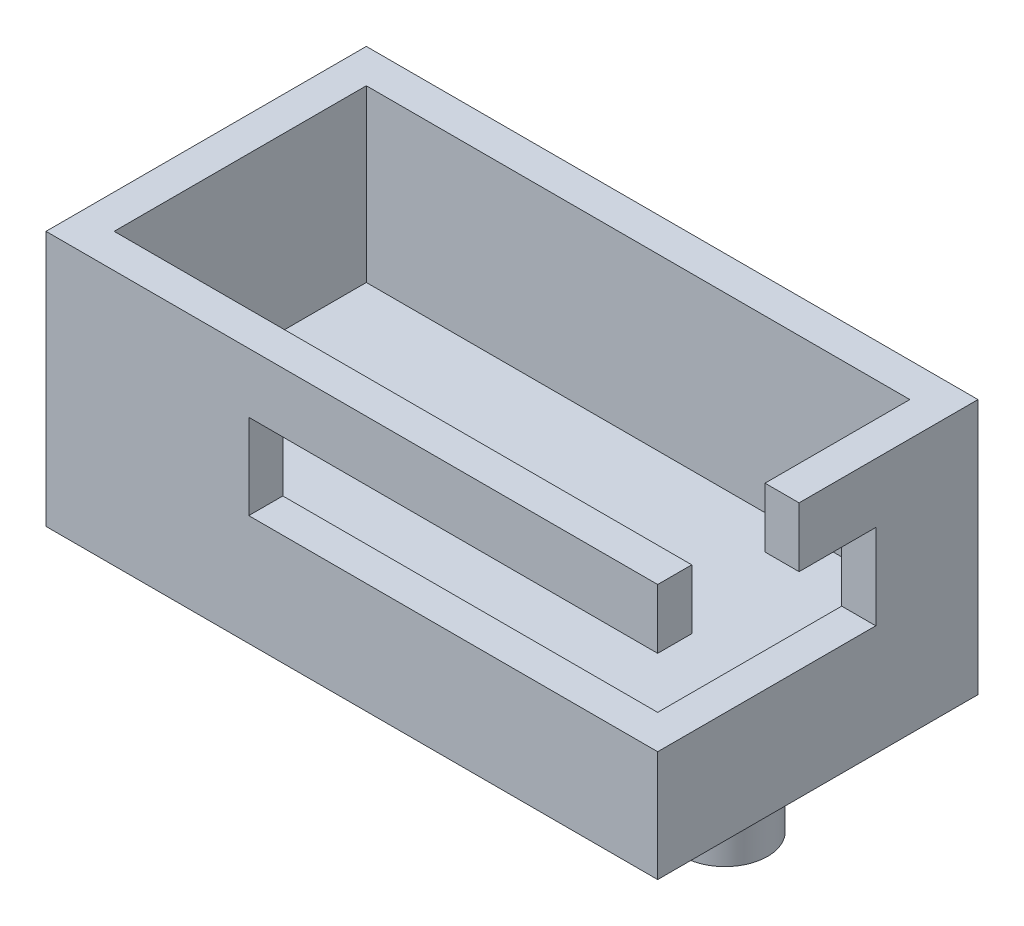
ISO-10303-21;
HEADER;
FILE_DESCRIPTION(('STEP AP214'),'2;1');
FILE_NAME('part.step','',(''),(''),'','','');
FILE_SCHEMA(('AUTOMOTIVE_DESIGN { 1 0 10303 214 1 1 1 1 }'));
ENDSEC;
DATA;
#1=APPLICATION_CONTEXT('core data for automotive mechanical design processes');
#2=APPLICATION_PROTOCOL_DEFINITION('international standard','automotive_design',2000,#1);
#3=PRODUCT_CONTEXT('',#1,'mechanical');
#4=PRODUCT('Part','Part','',(#3));
#5=PRODUCT_RELATED_PRODUCT_CATEGORY('part','',(#4));
#6=PRODUCT_DEFINITION_FORMATION('','',#4);
#7=PRODUCT_DEFINITION_CONTEXT('part definition',#1,'design');
#8=PRODUCT_DEFINITION('design','',#6,#7);
#9=PRODUCT_DEFINITION_SHAPE('','',#8);
#10=(LENGTH_UNIT() NAMED_UNIT(*) SI_UNIT(.MILLI.,.METRE.));
#11=(NAMED_UNIT(*) PLANE_ANGLE_UNIT() SI_UNIT($,.RADIAN.));
#12=(NAMED_UNIT(*) SI_UNIT($,.STERADIAN.) SOLID_ANGLE_UNIT());
#13=UNCERTAINTY_MEASURE_WITH_UNIT(LENGTH_MEASURE(1.E-05),#10,'distance_accuracy_value','');
#14=(GEOMETRIC_REPRESENTATION_CONTEXT(3) GLOBAL_UNCERTAINTY_ASSIGNED_CONTEXT((#13)) GLOBAL_UNIT_ASSIGNED_CONTEXT((#10,
#11,#12)) REPRESENTATION_CONTEXT('',''));
#15=CARTESIAN_POINT('',(0.,0.,0.));
#16=DIRECTION('',(0.,0.,1.));
#17=DIRECTION('',(1.,0.,0.));
#18=AXIS2_PLACEMENT_3D('',#15,#16,#17);
#19=CARTESIAN_POINT('',(33.9,10.,2.));
#20=DIRECTION('',(-1.,0.,0.));
#21=DIRECTION('',(0.,0.,1.));
#22=AXIS2_PLACEMENT_3D('',#19,#20,#21);
#23=PLANE('',#22);
#24=DIRECTION('',(0.,0.,-1.));
#25=VECTOR('',#24,1.);
#26=CARTESIAN_POINT('',(33.9,10.,2.));
#27=LINE('',#26,#25);
#28=CARTESIAN_POINT('',(33.9,10.,-6.3));
#29=VERTEX_POINT('',#28);
#30=CARTESIAN_POINT('',(33.9,10.,-16.8));
#31=VERTEX_POINT('',#30);
#32=EDGE_CURVE('E195',#29,#31,#27,.T.);
#33=ORIENTED_EDGE('',*,*,#32,.F.);
#34=DIRECTION('',(0.,1.,0.));
#35=VECTOR('',#34,1.);
#36=CARTESIAN_POINT('',(33.9,6.5,-6.3));
#37=LINE('',#36,#35);
#38=CARTESIAN_POINT('',(33.9,6.5,-6.3));
#39=VERTEX_POINT('',#38);
#40=EDGE_CURVE('E185',#39,#29,#37,.T.);
#41=ORIENTED_EDGE('',*,*,#40,.F.);
#42=DIRECTION('',(0.,0.,1.));
#43=VECTOR('',#42,1.);
#44=CARTESIAN_POINT('',(33.9,6.5,-41.3153013442625));
#45=LINE('',#44,#43);
#46=CARTESIAN_POINT('',(33.9,6.5,-10.8));
#47=VERTEX_POINT('',#46);
#48=EDGE_CURVE('E300',#47,#39,#45,.T.);
#49=ORIENTED_EDGE('',*,*,#48,.F.);
#50=DIRECTION('',(0.,-1.,0.));
#51=VECTOR('',#50,1.);
#52=CARTESIAN_POINT('',(33.9,6.5,-10.8));
#53=LINE('',#52,#51);
#54=CARTESIAN_POINT('',(33.9,1.5,-10.8));
#55=VERTEX_POINT('',#54);
#56=EDGE_CURVE('E278',#47,#55,#53,.T.);
#57=ORIENTED_EDGE('',*,*,#56,.T.);
#58=DIRECTION('',(0.,0.,1.));
#59=VECTOR('',#58,1.);
#60=CARTESIAN_POINT('',(33.9,1.5,-41.3153013442625));
#61=LINE('',#60,#59);
#62=CARTESIAN_POINT('',(33.9,1.5,2.));
#63=VERTEX_POINT('',#62);
#64=EDGE_CURVE('E304',#55,#63,#61,.T.);
#65=ORIENTED_EDGE('',*,*,#64,.T.);
#66=DIRECTION('',(0.,-1.,0.));
#67=VECTOR('',#66,1.);
#68=CARTESIAN_POINT('',(33.9,10.,2.));
#69=LINE('',#68,#67);
#70=CARTESIAN_POINT('',(33.9,-5.,2.));
#71=VERTEX_POINT('',#70);
#72=EDGE_CURVE('E215',#63,#71,#69,.T.);
#73=ORIENTED_EDGE('',*,*,#72,.T.);
#74=DIRECTION('',(0.,0.,-1.));
#75=VECTOR('',#74,1.);
#76=CARTESIAN_POINT('',(33.9,-5.,0.));
#77=LINE('',#76,#75);
#78=CARTESIAN_POINT('',(33.9,-5.,-16.8));
#79=VERTEX_POINT('',#78);
#80=EDGE_CURVE('E326',#71,#79,#77,.T.);
#81=ORIENTED_EDGE('',*,*,#80,.T.);
#82=DIRECTION('',(0.,-1.,0.));
#83=VECTOR('',#82,1.);
#84=CARTESIAN_POINT('',(33.9,10.,-16.8));
#85=LINE('',#84,#83);
#86=EDGE_CURVE('E212',#31,#79,#85,.T.);
#87=ORIENTED_EDGE('',*,*,#86,.F.);
#88=EDGE_LOOP('',(#33,#41,#49,#57,#65,#73,#81,#87));
#89=FACE_BOUND('',#88,.T.);
#90=ADVANCED_FACE('F49',(#89),#23,.F.);
#91=CARTESIAN_POINT('',(9.9,6.5,-41.3153013442625));
#92=DIRECTION('',(0.,1.,0.));
#93=DIRECTION('',(-1.,0.,0.));
#94=AXIS2_PLACEMENT_3D('',#91,#92,#93);
#95=PLANE('',#94);
#96=ORIENTED_EDGE('',*,*,#48,.T.);
#97=DIRECTION('',(1.,0.,0.));
#98=VECTOR('',#97,1.);
#99=CARTESIAN_POINT('',(24.6930589013091,6.5,-6.3));
#100=LINE('',#99,#98);
#101=CARTESIAN_POINT('',(31.9,6.5,-6.3));
#102=VERTEX_POINT('',#101);
#103=EDGE_CURVE('E268',#102,#39,#100,.T.);
#104=ORIENTED_EDGE('',*,*,#103,.F.);
#105=DIRECTION('',(0.,0.,-1.));
#106=VECTOR('',#105,1.);
#107=CARTESIAN_POINT('',(31.9,6.5,0.));
#108=LINE('',#107,#106);
#109=CARTESIAN_POINT('',(31.9,6.5,-10.8));
#110=VERTEX_POINT('',#109);
#111=EDGE_CURVE('E226',#102,#110,#108,.T.);
#112=ORIENTED_EDGE('',*,*,#111,.T.);
#113=DIRECTION('',(1.,0.,0.));
#114=VECTOR('',#113,1.);
#115=CARTESIAN_POINT('',(9.9,6.5,-10.8));
#116=LINE('',#115,#114);
#117=EDGE_CURVE('E282',#110,#47,#116,.T.);
#118=ORIENTED_EDGE('',*,*,#117,.T.);
#119=EDGE_LOOP('',(#96,#104,#112,#118));
#120=FACE_BOUND('',#119,.T.);
#121=ADVANCED_FACE('F387',(#120),#95,.F.);
#122=CARTESIAN_POINT('',(0.,10.,0.));
#123=DIRECTION('',(0.,1.,0.));
#124=DIRECTION('',(0.,0.,1.));
#125=AXIS2_PLACEMENT_3D('',#122,#123,#124);
#126=PLANE('',#125);
#127=DIRECTION('',(1.,0.,0.));
#128=VECTOR('',#127,1.);
#129=CARTESIAN_POINT('',(24.6930589013091,10.,-6.3));
#130=LINE('',#129,#128);
#131=CARTESIAN_POINT('',(31.9,10.,-6.3));
#132=VERTEX_POINT('',#131);
#133=EDGE_CURVE('E272',#132,#29,#130,.T.);
#134=ORIENTED_EDGE('',*,*,#133,.T.);
#135=ORIENTED_EDGE('',*,*,#32,.T.);
#136=DIRECTION('',(-1.,0.,0.));
#137=VECTOR('',#136,1.);
#138=CARTESIAN_POINT('',(-2.,10.,-16.8));
#139=LINE('',#138,#137);
#140=CARTESIAN_POINT('',(-2.,10.,-16.8));
#141=VERTEX_POINT('',#140);
#142=EDGE_CURVE('E194',#31,#141,#139,.T.);
#143=ORIENTED_EDGE('',*,*,#142,.T.);
#144=DIRECTION('',(0.,0.,1.));
#145=VECTOR('',#144,1.);
#146=CARTESIAN_POINT('',(-2.,10.,2.));
#147=LINE('',#146,#145);
#148=CARTESIAN_POINT('',(-2.,10.,2.));
#149=VERTEX_POINT('',#148);
#150=EDGE_CURVE('E199',#141,#149,#147,.T.);
#151=ORIENTED_EDGE('',*,*,#150,.T.);
#152=DIRECTION('',(1.,0.,0.));
#153=VECTOR('',#152,1.);
#154=CARTESIAN_POINT('',(-2.,10.,2.));
#155=LINE('',#154,#153);
#156=CARTESIAN_POINT('',(33.9,10.,2.));
#157=VERTEX_POINT('',#156);
#158=EDGE_CURVE('E191',#149,#157,#155,.T.);
#159=ORIENTED_EDGE('',*,*,#158,.T.);
#160=CARTESIAN_POINT('',(33.9,10.,0.));
#161=VERTEX_POINT('',#160);
#162=EDGE_CURVE('E181',#157,#161,#27,.T.);
#163=ORIENTED_EDGE('',*,*,#162,.T.);
#164=DIRECTION('',(1.,0.,0.));
#165=VECTOR('',#164,1.);
#166=CARTESIAN_POINT('',(0.,10.,0.));
#167=LINE('',#166,#165);
#168=CARTESIAN_POINT('',(0.,10.,0.));
#169=VERTEX_POINT('',#168);
#170=EDGE_CURVE('E164',#169,#161,#167,.T.);
#171=ORIENTED_EDGE('',*,*,#170,.F.);
#172=DIRECTION('',(0.,0.,1.));
#173=VECTOR('',#172,1.);
#174=CARTESIAN_POINT('',(0.,10.,0.));
#175=LINE('',#174,#173);
#176=CARTESIAN_POINT('',(0.,10.,-14.8));
#177=VERTEX_POINT('',#176);
#178=EDGE_CURVE('E176',#177,#169,#175,.T.);
#179=ORIENTED_EDGE('',*,*,#178,.F.);
#180=DIRECTION('',(-1.,0.,0.));
#181=VECTOR('',#180,1.);
#182=CARTESIAN_POINT('',(0.,10.,-14.8));
#183=LINE('',#182,#181);
#184=CARTESIAN_POINT('',(31.9,10.,-14.8));
#185=VERTEX_POINT('',#184);
#186=EDGE_CURVE('E340',#185,#177,#183,.T.);
#187=ORIENTED_EDGE('',*,*,#186,.F.);
#188=DIRECTION('',(0.,0.,-1.));
#189=VECTOR('',#188,1.);
#190=CARTESIAN_POINT('',(31.9,10.,0.));
#191=LINE('',#190,#189);
#192=EDGE_CURVE('E175',#132,#185,#191,.T.);
#193=ORIENTED_EDGE('',*,*,#192,.F.);
#194=EDGE_LOOP('',(#134,#135,#143,#151,#159,#163,#171,#179,#187,#193));
#195=FACE_BOUND('',#194,.T.);
#196=ADVANCED_FACE('F189',(#195),#126,.T.);
#197=CARTESIAN_POINT('',(-2.,10.,2.));
#198=DIRECTION('',(0.,0.,-1.));
#199=DIRECTION('',(-1.,0.,0.));
#200=AXIS2_PLACEMENT_3D('',#197,#198,#199);
#201=PLANE('',#200);
#202=DIRECTION('',(0.,-1.,0.));
#203=VECTOR('',#202,1.);
#204=CARTESIAN_POINT('',(9.9,6.5,2.));
#205=LINE('',#204,#203);
#206=CARTESIAN_POINT('',(9.9,6.5,2.));
#207=VERTEX_POINT('',#206);
#208=CARTESIAN_POINT('',(9.9,1.5,2.));
#209=VERTEX_POINT('',#208);
#210=EDGE_CURVE('E275',#207,#209,#205,.T.);
#211=ORIENTED_EDGE('',*,*,#210,.F.);
#212=DIRECTION('',(-1.,0.,0.));
#213=VECTOR('',#212,1.);
#214=CARTESIAN_POINT('',(9.9,6.5,2.));
#215=LINE('',#214,#213);
#216=CARTESIAN_POINT('',(33.9,6.5,2.));
#217=VERTEX_POINT('',#216);
#218=EDGE_CURVE('E293',#217,#207,#215,.T.);
#219=ORIENTED_EDGE('',*,*,#218,.F.);
#220=EDGE_CURVE('E216',#157,#217,#69,.T.);
#221=ORIENTED_EDGE('',*,*,#220,.F.);
#222=ORIENTED_EDGE('',*,*,#158,.F.);
#223=DIRECTION('',(0.,-1.,0.));
#224=VECTOR('',#223,1.);
#225=CARTESIAN_POINT('',(-2.,10.,2.));
#226=LINE('',#225,#224);
#227=CARTESIAN_POINT('',(-2.,-5.,2.));
#228=VERTEX_POINT('',#227);
#229=EDGE_CURVE('E206',#149,#228,#226,.T.);
#230=ORIENTED_EDGE('',*,*,#229,.T.);
#231=DIRECTION('',(1.,0.,0.));
#232=VECTOR('',#231,1.);
#233=CARTESIAN_POINT('',(0.,-5.,2.));
#234=LINE('',#233,#232);
#235=EDGE_CURVE('E322',#228,#71,#234,.T.);
#236=ORIENTED_EDGE('',*,*,#235,.T.);
#237=ORIENTED_EDGE('',*,*,#72,.F.);
#238=DIRECTION('',(1.,0.,0.));
#239=VECTOR('',#238,1.);
#240=CARTESIAN_POINT('',(9.9,1.5,2.));
#241=LINE('',#240,#239);
#242=EDGE_CURVE('E290',#209,#63,#241,.T.);
#243=ORIENTED_EDGE('',*,*,#242,.F.);
#244=EDGE_LOOP('',(#211,#219,#221,#222,#230,#236,#237,#243));
#245=FACE_BOUND('',#244,.T.);
#246=ADVANCED_FACE('F421',(#245),#201,.F.);
#247=CARTESIAN_POINT('',(33.9,6.5,0.));
#248=VERTEX_POINT('',#247);
#249=EDGE_CURVE('E183',#248,#217,#45,.T.);
#250=ORIENTED_EDGE('',*,*,#249,.F.);
#251=DIRECTION('',(0.,-1.,0.));
#252=VECTOR('',#251,1.);
#253=CARTESIAN_POINT('',(33.9,6.5,0.));
#254=LINE('',#253,#252);
#255=EDGE_CURVE('E167',#161,#248,#254,.T.);
#256=ORIENTED_EDGE('',*,*,#255,.F.);
#257=ORIENTED_EDGE('',*,*,#162,.F.);
#258=ORIENTED_EDGE('',*,*,#220,.T.);
#259=EDGE_LOOP('',(#250,#256,#257,#258));
#260=FACE_BOUND('',#259,.T.);
#261=ADVANCED_FACE('F179',(#260),#23,.F.);
#262=CARTESIAN_POINT('',(-2.,10.,-16.8));
#263=DIRECTION('',(0.,0.,1.));
#264=DIRECTION('',(1.,0.,0.));
#265=AXIS2_PLACEMENT_3D('',#262,#263,#264);
#266=PLANE('',#265);
#267=ORIENTED_EDGE('',*,*,#86,.T.);
#268=DIRECTION('',(1.,0.,0.));
#269=VECTOR('',#268,1.);
#270=CARTESIAN_POINT('',(0.,-5.,-16.8));
#271=LINE('',#270,#269);
#272=CARTESIAN_POINT('',(-2.,-5.,-16.8));
#273=VERTEX_POINT('',#272);
#274=EDGE_CURVE('E330',#273,#79,#271,.T.);
#275=ORIENTED_EDGE('',*,*,#274,.F.);
#276=DIRECTION('',(0.,-1.,0.));
#277=VECTOR('',#276,1.);
#278=CARTESIAN_POINT('',(-2.,10.,-16.8));
#279=LINE('',#278,#277);
#280=EDGE_CURVE('E209',#141,#273,#279,.T.);
#281=ORIENTED_EDGE('',*,*,#280,.F.);
#282=ORIENTED_EDGE('',*,*,#142,.F.);
#283=EDGE_LOOP('',(#267,#275,#281,#282));
#284=FACE_BOUND('',#283,.T.);
#285=ADVANCED_FACE('F420',(#284),#266,.F.);
#286=CARTESIAN_POINT('',(-2.,10.,2.));
#287=DIRECTION('',(1.,0.,0.));
#288=DIRECTION('',(0.,0.,-1.));
#289=AXIS2_PLACEMENT_3D('',#286,#287,#288);
#290=PLANE('',#289);
#291=ORIENTED_EDGE('',*,*,#280,.T.);
#292=DIRECTION('',(0.,0.,-1.));
#293=VECTOR('',#292,1.);
#294=CARTESIAN_POINT('',(-2.,-5.,0.));
#295=LINE('',#294,#293);
#296=EDGE_CURVE('E318',#228,#273,#295,.T.);
#297=ORIENTED_EDGE('',*,*,#296,.F.);
#298=ORIENTED_EDGE('',*,*,#229,.F.);
#299=ORIENTED_EDGE('',*,*,#150,.F.);
#300=EDGE_LOOP('',(#291,#297,#298,#299));
#301=FACE_BOUND('',#300,.T.);
#302=ADVANCED_FACE('F427',(#301),#290,.F.);
#303=CARTESIAN_POINT('',(0.,10.,0.));
#304=DIRECTION('',(1.,0.,0.));
#305=DIRECTION('',(0.,0.,-1.));
#306=AXIS2_PLACEMENT_3D('',#303,#304,#305);
#307=PLANE('',#306);
#308=DIRECTION('',(0.,0.,1.));
#309=VECTOR('',#308,1.);
#310=CARTESIAN_POINT('',(0.,0.,0.));
#311=LINE('',#310,#309);
#312=CARTESIAN_POINT('',(0.,0.,-14.8));
#313=VERTEX_POINT('',#312);
#314=CARTESIAN_POINT('',(0.,0.,0.));
#315=VERTEX_POINT('',#314);
#316=EDGE_CURVE('E334',#313,#315,#311,.T.);
#317=ORIENTED_EDGE('',*,*,#316,.F.);
#318=DIRECTION('',(0.,-1.,0.));
#319=VECTOR('',#318,1.);
#320=CARTESIAN_POINT('',(0.,10.,-14.8));
#321=LINE('',#320,#319);
#322=EDGE_CURVE('E343',#177,#313,#321,.T.);
#323=ORIENTED_EDGE('',*,*,#322,.F.);
#324=ORIENTED_EDGE('',*,*,#178,.T.);
#325=DIRECTION('',(0.,-1.,0.));
#326=VECTOR('',#325,1.);
#327=CARTESIAN_POINT('',(0.,10.,0.));
#328=LINE('',#327,#326);
#329=EDGE_CURVE('E170',#169,#315,#328,.T.);
#330=ORIENTED_EDGE('',*,*,#329,.T.);
#331=EDGE_LOOP('',(#317,#323,#324,#330));
#332=FACE_BOUND('',#331,.T.);
#333=ADVANCED_FACE('F369',(#332),#307,.T.);
#334=CARTESIAN_POINT('',(0.,10.,0.));
#335=DIRECTION('',(0.,0.,-1.));
#336=DIRECTION('',(-1.,0.,0.));
#337=AXIS2_PLACEMENT_3D('',#334,#335,#336);
#338=PLANE('',#337);
#339=DIRECTION('',(1.,0.,0.));
#340=VECTOR('',#339,1.);
#341=CARTESIAN_POINT('',(0.,6.5,0.));
#342=LINE('',#341,#340);
#343=CARTESIAN_POINT('',(9.9,6.5,0.));
#344=VERTEX_POINT('',#343);
#345=EDGE_CURVE('E65',#344,#248,#342,.T.);
#346=ORIENTED_EDGE('',*,*,#345,.F.);
#347=DIRECTION('',(0.,1.,0.));
#348=VECTOR('',#347,1.);
#349=CARTESIAN_POINT('',(9.9,10.,0.));
#350=LINE('',#349,#348);
#351=CARTESIAN_POINT('',(9.9,1.5,0.));
#352=VERTEX_POINT('',#351);
#353=EDGE_CURVE('E229',#352,#344,#350,.T.);
#354=ORIENTED_EDGE('',*,*,#353,.F.);
#355=DIRECTION('',(-1.,0.,0.));
#356=VECTOR('',#355,1.);
#357=CARTESIAN_POINT('',(0.,1.5,0.));
#358=LINE('',#357,#356);
#359=CARTESIAN_POINT('',(31.9,1.5,0.));
#360=VERTEX_POINT('',#359);
#361=EDGE_CURVE('E313',#360,#352,#358,.T.);
#362=ORIENTED_EDGE('',*,*,#361,.F.);
#363=DIRECTION('',(0.,-1.,0.));
#364=VECTOR('',#363,1.);
#365=CARTESIAN_POINT('',(31.9,10.,0.));
#366=LINE('',#365,#364);
#367=CARTESIAN_POINT('',(31.9,0.,0.));
#368=VERTEX_POINT('',#367);
#369=EDGE_CURVE('E363',#360,#368,#366,.T.);
#370=ORIENTED_EDGE('',*,*,#369,.T.);
#371=DIRECTION('',(1.,0.,0.));
#372=VECTOR('',#371,1.);
#373=CARTESIAN_POINT('',(0.,0.,0.));
#374=LINE('',#373,#372);
#375=EDGE_CURVE('E347',#315,#368,#374,.T.);
#376=ORIENTED_EDGE('',*,*,#375,.F.);
#377=ORIENTED_EDGE('',*,*,#329,.F.);
#378=ORIENTED_EDGE('',*,*,#170,.T.);
#379=ORIENTED_EDGE('',*,*,#255,.T.);
#380=EDGE_LOOP('',(#346,#354,#362,#370,#376,#377,#378,#379));
#381=FACE_BOUND('',#380,.T.);
#382=ADVANCED_FACE('F166',(#381),#338,.T.);
#383=CARTESIAN_POINT('',(31.9,10.,0.));
#384=DIRECTION('',(-1.,0.,0.));
#385=DIRECTION('',(0.,0.,1.));
#386=AXIS2_PLACEMENT_3D('',#383,#384,#385);
#387=PLANE('',#386);
#388=DIRECTION('',(0.,1.,0.));
#389=VECTOR('',#388,1.);
#390=CARTESIAN_POINT('',(31.9,6.5,-6.3));
#391=LINE('',#390,#389);
#392=EDGE_CURVE('E73',#102,#132,#391,.T.);
#393=ORIENTED_EDGE('',*,*,#392,.T.);
#394=ORIENTED_EDGE('',*,*,#192,.T.);
#395=DIRECTION('',(0.,-1.,0.));
#396=VECTOR('',#395,1.);
#397=CARTESIAN_POINT('',(31.9,10.,-14.8));
#398=LINE('',#397,#396);
#399=CARTESIAN_POINT('',(31.9,0.,-14.8));
#400=VERTEX_POINT('',#399);
#401=EDGE_CURVE('E360',#185,#400,#398,.T.);
#402=ORIENTED_EDGE('',*,*,#401,.T.);
#403=DIRECTION('',(0.,0.,-1.));
#404=VECTOR('',#403,1.);
#405=CARTESIAN_POINT('',(31.9,0.,0.));
#406=LINE('',#405,#404);
#407=EDGE_CURVE('E351',#368,#400,#406,.T.);
#408=ORIENTED_EDGE('',*,*,#407,.F.);
#409=ORIENTED_EDGE('',*,*,#369,.F.);
#410=DIRECTION('',(0.,0.,1.));
#411=VECTOR('',#410,1.);
#412=CARTESIAN_POINT('',(31.9,1.5,0.));
#413=LINE('',#412,#411);
#414=CARTESIAN_POINT('',(31.9,1.5,-10.8));
#415=VERTEX_POINT('',#414);
#416=EDGE_CURVE('E223',#415,#360,#413,.T.);
#417=ORIENTED_EDGE('',*,*,#416,.F.);
#418=DIRECTION('',(0.,1.,0.));
#419=VECTOR('',#418,1.);
#420=CARTESIAN_POINT('',(31.9,10.,-10.8));
#421=LINE('',#420,#419);
#422=EDGE_CURVE('E219',#415,#110,#421,.T.);
#423=ORIENTED_EDGE('',*,*,#422,.T.);
#424=ORIENTED_EDGE('',*,*,#111,.F.);
#425=EDGE_LOOP('',(#393,#394,#402,#408,#409,#417,#423,#424));
#426=FACE_BOUND('',#425,.T.);
#427=ADVANCED_FACE('F382',(#426),#387,.T.);
#428=CARTESIAN_POINT('',(0.,10.,-14.8));
#429=DIRECTION('',(0.,0.,1.));
#430=DIRECTION('',(1.,0.,0.));
#431=AXIS2_PLACEMENT_3D('',#428,#429,#430);
#432=PLANE('',#431);
#433=DIRECTION('',(-1.,0.,0.));
#434=VECTOR('',#433,1.);
#435=CARTESIAN_POINT('',(0.,0.,-14.8));
#436=LINE('',#435,#434);
#437=EDGE_CURVE('E336',#400,#313,#436,.T.);
#438=ORIENTED_EDGE('',*,*,#437,.F.);
#439=ORIENTED_EDGE('',*,*,#401,.F.);
#440=ORIENTED_EDGE('',*,*,#186,.T.);
#441=ORIENTED_EDGE('',*,*,#322,.T.);
#442=EDGE_LOOP('',(#438,#439,#440,#441));
#443=FACE_BOUND('',#442,.T.);
#444=ADVANCED_FACE('F377',(#443),#432,.T.);
#445=CARTESIAN_POINT('',(0.,0.,0.));
#446=DIRECTION('',(0.,1.,0.));
#447=DIRECTION('',(0.,0.,1.));
#448=AXIS2_PLACEMENT_3D('',#445,#446,#447);
#449=PLANE('',#448);
#450=ORIENTED_EDGE('',*,*,#437,.T.);
#451=ORIENTED_EDGE('',*,*,#316,.T.);
#452=ORIENTED_EDGE('',*,*,#375,.T.);
#453=ORIENTED_EDGE('',*,*,#407,.T.);
#454=EDGE_LOOP('',(#450,#451,#452,#453));
#455=FACE_BOUND('',#454,.T.);
#456=ADVANCED_FACE('F372',(#455),#449,.T.);
#457=CARTESIAN_POINT('',(0.,-5.,0.));
#458=DIRECTION('',(0.,1.,0.));
#459=DIRECTION('',(0.,0.,1.));
#460=AXIS2_PLACEMENT_3D('',#457,#458,#459);
#461=PLANE('',#460);
#462=CARTESIAN_POINT('',(28.45,-5.,-7.4));
#463=DIRECTION('',(0.,1.,0.));
#464=DIRECTION('',(0.,0.,1.));
#465=AXIS2_PLACEMENT_3D('',#462,#463,#464);
#466=CIRCLE('',#465,2.9);
#467=CARTESIAN_POINT('',(28.45,-5.,-4.5));
#468=VERTEX_POINT('',#467);
#469=EDGE_CURVE('E58',#468,#468,#466,.T.);
#470=ORIENTED_EDGE('',*,*,#469,.T.);
#471=EDGE_LOOP('',(#470));
#472=FACE_BOUND('',#471,.T.);
#473=CARTESIAN_POINT('',(3.45,-5.,-7.4));
#474=DIRECTION('',(0.,1.,0.));
#475=DIRECTION('',(0.,0.,1.));
#476=AXIS2_PLACEMENT_3D('',#473,#474,#475);
#477=CIRCLE('',#476,2.9);
#478=CARTESIAN_POINT('',(3.45,-5.,-4.5));
#479=VERTEX_POINT('',#478);
#480=EDGE_CURVE('E236',#479,#479,#477,.T.);
#481=ORIENTED_EDGE('',*,*,#480,.T.);
#482=EDGE_LOOP('',(#481));
#483=FACE_BOUND('',#482,.T.);
#484=ORIENTED_EDGE('',*,*,#296,.T.);
#485=ORIENTED_EDGE('',*,*,#274,.T.);
#486=ORIENTED_EDGE('',*,*,#80,.F.);
#487=ORIENTED_EDGE('',*,*,#235,.F.);
#488=EDGE_LOOP('',(#484,#485,#486,#487));
#489=FACE_BOUND('',#488,.T.);
#490=ADVANCED_FACE('F243',(#472,#483,#489),#461,.F.);
#491=CARTESIAN_POINT('',(9.9,6.5,-41.3153013442625));
#492=DIRECTION('',(-1.,0.,0.));
#493=DIRECTION('',(0.,-1.,0.));
#494=AXIS2_PLACEMENT_3D('',#491,#492,#493);
#495=PLANE('',#494);
#496=ORIENTED_EDGE('',*,*,#353,.T.);
#497=DIRECTION('',(0.,0.,1.));
#498=VECTOR('',#497,1.);
#499=CARTESIAN_POINT('',(9.9,6.5,-41.3153013442625));
#500=LINE('',#499,#498);
#501=EDGE_CURVE('E283',#344,#207,#500,.T.);
#502=ORIENTED_EDGE('',*,*,#501,.T.);
#503=ORIENTED_EDGE('',*,*,#210,.T.);
#504=DIRECTION('',(0.,0.,1.));
#505=VECTOR('',#504,1.);
#506=CARTESIAN_POINT('',(9.9,1.5,-41.3153013442625));
#507=LINE('',#506,#505);
#508=EDGE_CURVE('E297',#352,#209,#507,.T.);
#509=ORIENTED_EDGE('',*,*,#508,.F.);
#510=EDGE_LOOP('',(#496,#502,#503,#509));
#511=FACE_BOUND('',#510,.T.);
#512=ADVANCED_FACE('F442',(#511),#495,.F.);
#513=ORIENTED_EDGE('',*,*,#345,.T.);
#514=ORIENTED_EDGE('',*,*,#249,.T.);
#515=ORIENTED_EDGE('',*,*,#218,.T.);
#516=ORIENTED_EDGE('',*,*,#501,.F.);
#517=EDGE_LOOP('',(#513,#514,#515,#516));
#518=FACE_BOUND('',#517,.T.);
#519=ADVANCED_FACE('F416',(#518),#95,.F.);
#520=CARTESIAN_POINT('',(9.9,1.5,-41.3153013442625));
#521=DIRECTION('',(0.,-1.,0.));
#522=DIRECTION('',(0.,0.,-1.));
#523=AXIS2_PLACEMENT_3D('',#520,#521,#522);
#524=PLANE('',#523);
#525=ORIENTED_EDGE('',*,*,#361,.T.);
#526=ORIENTED_EDGE('',*,*,#508,.T.);
#527=ORIENTED_EDGE('',*,*,#242,.T.);
#528=ORIENTED_EDGE('',*,*,#64,.F.);
#529=DIRECTION('',(-1.,0.,0.));
#530=VECTOR('',#529,1.);
#531=CARTESIAN_POINT('',(9.9,1.5,-10.8));
#532=LINE('',#531,#530);
#533=EDGE_CURVE('E286',#55,#415,#532,.T.);
#534=ORIENTED_EDGE('',*,*,#533,.T.);
#535=ORIENTED_EDGE('',*,*,#416,.T.);
#536=EDGE_LOOP('',(#525,#526,#527,#528,#534,#535));
#537=FACE_BOUND('',#536,.T.);
#538=ADVANCED_FACE('F408',(#537),#524,.F.);
#539=CARTESIAN_POINT('',(-2.,10.,-10.8));
#540=DIRECTION('',(0.,0.,1.));
#541=DIRECTION('',(1.,0.,0.));
#542=AXIS2_PLACEMENT_3D('',#539,#540,#541);
#543=PLANE('',#542);
#544=ORIENTED_EDGE('',*,*,#533,.F.);
#545=ORIENTED_EDGE('',*,*,#56,.F.);
#546=ORIENTED_EDGE('',*,*,#117,.F.);
#547=ORIENTED_EDGE('',*,*,#422,.F.);
#548=EDGE_LOOP('',(#544,#545,#546,#547));
#549=FACE_BOUND('',#548,.T.);
#550=ADVANCED_FACE('F390',(#549),#543,.T.);
#551=CARTESIAN_POINT('',(24.6930589013091,6.5,-6.3));
#552=DIRECTION('',(0.,0.,-1.));
#553=DIRECTION('',(-1.,0.,0.));
#554=AXIS2_PLACEMENT_3D('',#551,#552,#553);
#555=PLANE('',#554);
#556=ORIENTED_EDGE('',*,*,#103,.T.);
#557=ORIENTED_EDGE('',*,*,#40,.T.);
#558=ORIENTED_EDGE('',*,*,#133,.F.);
#559=ORIENTED_EDGE('',*,*,#392,.F.);
#560=EDGE_LOOP('',(#556,#557,#558,#559));
#561=FACE_BOUND('',#560,.T.);
#562=ADVANCED_FACE('F396',(#561),#555,.F.);
#563=CARTESIAN_POINT('',(3.45,-10.,-7.4));
#564=DIRECTION('',(0.,1.,0.));
#565=DIRECTION('',(0.,0.,1.));
#566=AXIS2_PLACEMENT_3D('',#563,#564,#565);
#567=CYLINDRICAL_SURFACE('',#566,2.5);
#568=CARTESIAN_POINT('',(3.45,-5.4,-7.4));
#569=DIRECTION('',(0.,1.,0.));
#570=DIRECTION('',(0.,0.,1.));
#571=AXIS2_PLACEMENT_3D('',#568,#569,#570);
#572=CIRCLE('',#571,2.5);
#573=CARTESIAN_POINT('',(3.45,-5.4,-4.9));
#574=VERTEX_POINT('',#573);
#575=EDGE_CURVE('E12',#574,#574,#572,.F.);
#576=ORIENTED_EDGE('',*,*,#575,.T.);
#577=EDGE_LOOP('',(#576));
#578=FACE_BOUND('',#577,.T.);
#579=CARTESIAN_POINT('',(3.45,-10.,-7.4));
#580=DIRECTION('',(0.,-1.,0.));
#581=DIRECTION('',(0.,0.,-1.));
#582=AXIS2_PLACEMENT_3D('',#579,#580,#581);
#583=CIRCLE('',#582,2.5);
#584=CARTESIAN_POINT('',(3.45,-10.,-9.9));
#585=VERTEX_POINT('',#584);
#586=EDGE_CURVE('E186',#585,#585,#583,.T.);
#587=ORIENTED_EDGE('',*,*,#586,.F.);
#588=EDGE_LOOP('',(#587));
#589=FACE_BOUND('',#588,.T.);
#590=ADVANCED_FACE('F398',(#578,#589),#567,.T.);
#591=CARTESIAN_POINT('',(3.45,-10.,-7.4));
#592=DIRECTION('',(0.,-1.,0.));
#593=DIRECTION('',(0.,0.,-1.));
#594=AXIS2_PLACEMENT_3D('',#591,#592,#593);
#595=PLANE('',#594);
#596=ORIENTED_EDGE('',*,*,#586,.T.);
#597=EDGE_LOOP('',(#596));
#598=FACE_BOUND('',#597,.T.);
#599=ADVANCED_FACE('F255',(#598),#595,.T.);
#600=CARTESIAN_POINT('',(28.45,-10.,-7.4));
#601=DIRECTION('',(0.,1.,0.));
#602=DIRECTION('',(0.,0.,1.));
#603=AXIS2_PLACEMENT_3D('',#600,#601,#602);
#604=CYLINDRICAL_SURFACE('',#603,2.5);
#605=CARTESIAN_POINT('',(28.45,-5.4,-7.4));
#606=DIRECTION('',(0.,1.,0.));
#607=DIRECTION('',(0.,0.,1.));
#608=AXIS2_PLACEMENT_3D('',#605,#606,#607);
#609=CIRCLE('',#608,2.5);
#610=CARTESIAN_POINT('',(28.45,-5.4,-4.9));
#611=VERTEX_POINT('',#610);
#612=EDGE_CURVE('E232',#611,#611,#609,.F.);
#613=ORIENTED_EDGE('',*,*,#612,.T.);
#614=EDGE_LOOP('',(#613));
#615=FACE_BOUND('',#614,.T.);
#616=CARTESIAN_POINT('',(28.45,-10.,-7.4));
#617=DIRECTION('',(0.,-1.,0.));
#618=DIRECTION('',(0.,0.,1.));
#619=AXIS2_PLACEMENT_3D('',#616,#617,#618);
#620=CIRCLE('',#619,2.5);
#621=CARTESIAN_POINT('',(28.45,-10.,-4.9));
#622=VERTEX_POINT('',#621);
#623=EDGE_CURVE('E259',#622,#622,#620,.T.);
#624=ORIENTED_EDGE('',*,*,#623,.F.);
#625=EDGE_LOOP('',(#624));
#626=FACE_BOUND('',#625,.T.);
#627=ADVANCED_FACE('F252',(#615,#626),#604,.T.);
#628=CARTESIAN_POINT('',(28.45,-10.,-7.4));
#629=DIRECTION('',(0.,1.,0.));
#630=DIRECTION('',(0.,0.,1.));
#631=AXIS2_PLACEMENT_3D('',#628,#629,#630);
#632=PLANE('',#631);
#633=ORIENTED_EDGE('',*,*,#623,.T.);
#634=EDGE_LOOP('',(#633));
#635=FACE_BOUND('',#634,.T.);
#636=ADVANCED_FACE('F249',(#635),#632,.F.);
#637=CARTESIAN_POINT('',(28.45,-5.4,-7.4));
#638=DIRECTION('',(0.,1.,0.));
#639=DIRECTION('',(0.,0.,1.));
#640=AXIS2_PLACEMENT_3D('',#637,#638,#639);
#641=TOROIDAL_SURFACE('',#640,2.9,0.4);
#642=ORIENTED_EDGE('',*,*,#469,.F.);
#643=EDGE_LOOP('',(#642));
#644=FACE_BOUND('',#643,.T.);
#645=ORIENTED_EDGE('',*,*,#612,.F.);
#646=EDGE_LOOP('',(#645));
#647=FACE_BOUND('',#646,.T.);
#648=ADVANCED_FACE('F246',(#644,#647),#641,.F.);
#649=CARTESIAN_POINT('',(3.45,-5.4,-7.4));
#650=DIRECTION('',(0.,1.,0.));
#651=DIRECTION('',(0.,0.,1.));
#652=AXIS2_PLACEMENT_3D('',#649,#650,#651);
#653=TOROIDAL_SURFACE('',#652,2.9,0.4);
#654=ORIENTED_EDGE('',*,*,#480,.F.);
#655=EDGE_LOOP('',(#654));
#656=FACE_BOUND('',#655,.T.);
#657=ORIENTED_EDGE('',*,*,#575,.F.);
#658=EDGE_LOOP('',(#657));
#659=FACE_BOUND('',#658,.T.);
#660=ADVANCED_FACE('F51',(#656,#659),#653,.F.);
#661=CLOSED_SHELL('',(#90,#121,#196,#246,#261,#285,#302,#333,#382,#427,#444,#456,#490,#512,#519,
#538,#550,#562,#590,#599,#627,#636,#648,#660));
#662=MANIFOLD_SOLID_BREP('B2',#661);
#663=ADVANCED_BREP_SHAPE_REPRESENTATION('',(#18,#662),#14);
#664=SHAPE_DEFINITION_REPRESENTATION(#9,#663);
ENDSEC;
END-ISO-10303-21;
